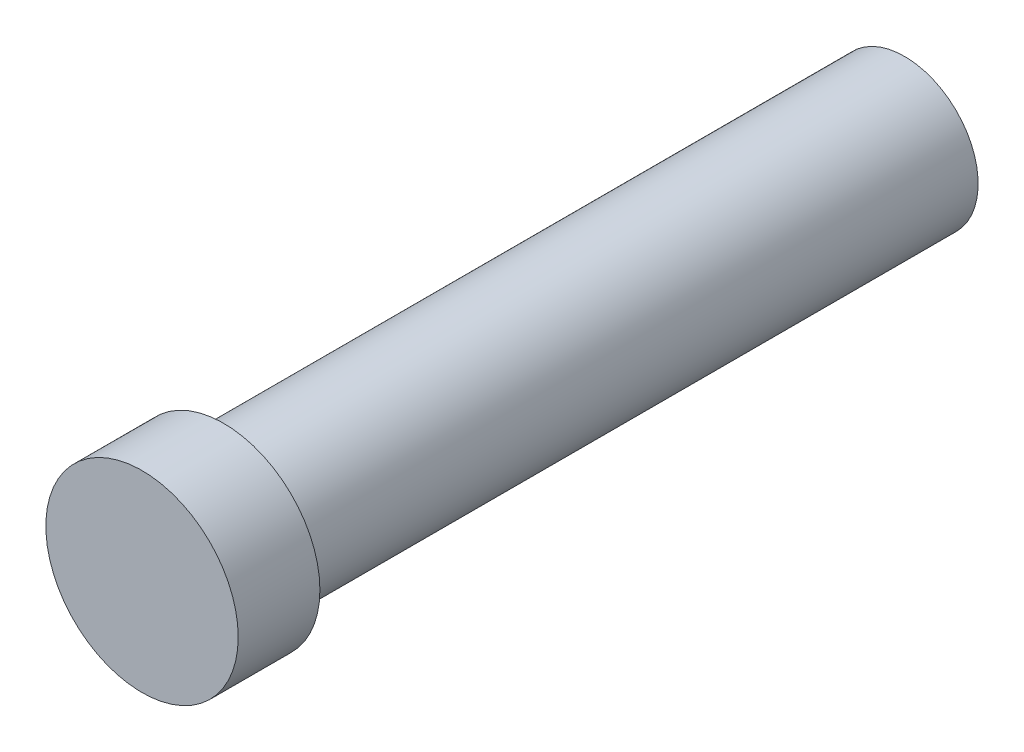
ISO-10303-21;
HEADER;
FILE_DESCRIPTION(('STEP AP214'),'2;1');
FILE_NAME('part.step','',(''),(''),'','','');
FILE_SCHEMA(('AUTOMOTIVE_DESIGN { 1 0 10303 214 1 1 1 1 }'));
ENDSEC;
DATA;
#1=APPLICATION_CONTEXT('core data for automotive mechanical design processes');
#2=APPLICATION_PROTOCOL_DEFINITION('international standard','automotive_design',2000,#1);
#3=PRODUCT_CONTEXT('',#1,'mechanical');
#4=PRODUCT('Part','Part','',(#3));
#5=PRODUCT_RELATED_PRODUCT_CATEGORY('part','',(#4));
#6=PRODUCT_DEFINITION_FORMATION('','',#4);
#7=PRODUCT_DEFINITION_CONTEXT('part definition',#1,'design');
#8=PRODUCT_DEFINITION('design','',#6,#7);
#9=PRODUCT_DEFINITION_SHAPE('','',#8);
#10=(LENGTH_UNIT() NAMED_UNIT(*) SI_UNIT(.MILLI.,.METRE.));
#11=(NAMED_UNIT(*) PLANE_ANGLE_UNIT() SI_UNIT($,.RADIAN.));
#12=(NAMED_UNIT(*) SI_UNIT($,.STERADIAN.) SOLID_ANGLE_UNIT());
#13=UNCERTAINTY_MEASURE_WITH_UNIT(LENGTH_MEASURE(1.E-05),#10,'distance_accuracy_value','');
#14=(GEOMETRIC_REPRESENTATION_CONTEXT(3) GLOBAL_UNCERTAINTY_ASSIGNED_CONTEXT((#13)) GLOBAL_UNIT_ASSIGNED_CONTEXT((#10,
#11,#12)) REPRESENTATION_CONTEXT('',''));
#15=CARTESIAN_POINT('',(0.,0.,0.));
#16=DIRECTION('',(0.,0.,1.));
#17=DIRECTION('',(1.,0.,0.));
#18=AXIS2_PLACEMENT_3D('',#15,#16,#17);
#19=CARTESIAN_POINT('',(0.,0.,14.));
#20=DIRECTION('',(0.,0.,-1.));
#21=DIRECTION('',(-1.,0.,0.));
#22=AXIS2_PLACEMENT_3D('',#19,#20,#21);
#23=CYLINDRICAL_SURFACE('',#22,1.35);
#24=CARTESIAN_POINT('',(0.,0.,0.));
#25=DIRECTION('',(0.,0.,1.));
#26=DIRECTION('',(1.,0.,0.));
#27=AXIS2_PLACEMENT_3D('',#24,#25,#26);
#28=CIRCLE('',#27,1.35);
#29=CARTESIAN_POINT('',(-1.35,0.,0.));
#30=VERTEX_POINT('',#29);
#31=EDGE_CURVE('E50',#30,#30,#28,.T.);
#32=CARTESIAN_POINT('',(0.,0.,12.5));
#33=DIRECTION('',(0.,0.,1.));
#34=DIRECTION('',(1.,0.,0.));
#35=AXIS2_PLACEMENT_3D('',#32,#33,#34);
#36=CIRCLE('',#35,1.35);
#37=CARTESIAN_POINT('',(-1.35,0.,12.5));
#38=VERTEX_POINT('',#37);
#39=EDGE_CURVE('E10',#38,#38,#36,.T.);
#40=CARTESIAN_POINT('',(-1.35,0.,0.));
#41=CARTESIAN_POINT('',(-1.35,0.,0.130208333333332));
#42=CARTESIAN_POINT('',(-1.35,0.,0.260416666666665));
#43=CARTESIAN_POINT('',(-1.35,0.,0.520833333333332));
#44=CARTESIAN_POINT('',(-1.35,0.,0.651041666666666));
#45=CARTESIAN_POINT('',(-1.35,0.,0.911458333333332));
#46=CARTESIAN_POINT('',(-1.35,0.,1.04166666666666));
#47=CARTESIAN_POINT('',(-1.35,0.,1.30208333333333));
#48=CARTESIAN_POINT('',(-1.35,0.,1.43229166666666));
#49=CARTESIAN_POINT('',(-1.35,0.,1.69270833333333));
#50=CARTESIAN_POINT('',(-1.35,0.,1.82291666666666));
#51=CARTESIAN_POINT('',(-1.35,0.,2.08333333333333));
#52=CARTESIAN_POINT('',(-1.35,0.,2.21354166666667));
#53=CARTESIAN_POINT('',(-1.35,0.,2.47395833333333));
#54=CARTESIAN_POINT('',(-1.35,0.,2.60416666666667));
#55=CARTESIAN_POINT('',(-1.35,0.,2.86458333333333));
#56=CARTESIAN_POINT('',(-1.35,0.,2.99479166666666));
#57=CARTESIAN_POINT('',(-1.35,0.,3.25520833333333));
#58=CARTESIAN_POINT('',(-1.35,0.,3.38541666666666));
#59=CARTESIAN_POINT('',(-1.35,0.,3.64583333333333));
#60=CARTESIAN_POINT('',(-1.35,0.,3.77604166666666));
#61=CARTESIAN_POINT('',(-1.35,0.,4.03645833333333));
#62=CARTESIAN_POINT('',(-1.35,0.,4.16666666666667));
#63=CARTESIAN_POINT('',(-1.35,0.,4.42708333333333));
#64=CARTESIAN_POINT('',(-1.35,0.,4.55729166666667));
#65=CARTESIAN_POINT('',(-1.35,0.,4.81770833333333));
#66=CARTESIAN_POINT('',(-1.35,0.,4.94791666666666));
#67=CARTESIAN_POINT('',(-1.35,0.,5.20833333333333));
#68=CARTESIAN_POINT('',(-1.35,0.,5.33854166666667));
#69=CARTESIAN_POINT('',(-1.35,0.,5.59895833333333));
#70=CARTESIAN_POINT('',(-1.35,0.,5.72916666666667));
#71=CARTESIAN_POINT('',(-1.35,0.,5.98958333333333));
#72=CARTESIAN_POINT('',(-1.35,0.,6.11979166666667));
#73=CARTESIAN_POINT('',(-1.35,0.,6.38020833333333));
#74=CARTESIAN_POINT('',(-1.35,0.,6.51041666666666));
#75=CARTESIAN_POINT('',(-1.35,0.,6.77083333333333));
#76=CARTESIAN_POINT('',(-1.35,0.,6.90104166666666));
#77=CARTESIAN_POINT('',(-1.35,0.,7.16145833333333));
#78=CARTESIAN_POINT('',(-1.35,0.,7.29166666666666));
#79=CARTESIAN_POINT('',(-1.35,0.,7.55208333333333));
#80=CARTESIAN_POINT('',(-1.35,0.,7.68229166666666));
#81=CARTESIAN_POINT('',(-1.35,0.,7.94270833333333));
#82=CARTESIAN_POINT('',(-1.35,0.,8.07291666666667));
#83=CARTESIAN_POINT('',(-1.35,0.,8.33333333333333));
#84=CARTESIAN_POINT('',(-1.35,0.,8.46354166666666));
#85=CARTESIAN_POINT('',(-1.35,0.,8.72395833333333));
#86=CARTESIAN_POINT('',(-1.35,0.,8.85416666666666));
#87=CARTESIAN_POINT('',(-1.35,0.,9.11458333333333));
#88=CARTESIAN_POINT('',(-1.35,0.,9.24479166666666));
#89=CARTESIAN_POINT('',(-1.35,0.,9.50520833333333));
#90=CARTESIAN_POINT('',(-1.35,0.,9.63541666666666));
#91=CARTESIAN_POINT('',(-1.35,0.,9.89583333333333));
#92=CARTESIAN_POINT('',(-1.35,0.,10.0260416666667));
#93=CARTESIAN_POINT('',(-1.35,0.,10.2864583333333));
#94=CARTESIAN_POINT('',(-1.35,0.,10.4166666666667));
#95=CARTESIAN_POINT('',(-1.35,0.,10.6770833333333));
#96=CARTESIAN_POINT('',(-1.35,0.,10.8072916666667));
#97=CARTESIAN_POINT('',(-1.35,0.,11.0677083333333));
#98=CARTESIAN_POINT('',(-1.35,0.,11.1979166666667));
#99=CARTESIAN_POINT('',(-1.35,0.,11.4583333333333));
#100=CARTESIAN_POINT('',(-1.35,0.,11.5885416666667));
#101=CARTESIAN_POINT('',(-1.35,0.,11.8489583333333));
#102=CARTESIAN_POINT('',(-1.35,0.,11.9791666666667));
#103=CARTESIAN_POINT('',(-1.35,0.,12.2395833333333));
#104=CARTESIAN_POINT('',(-1.35,0.,12.3697916666667));
#105=CARTESIAN_POINT('',(-1.35,0.,12.5));
#106=B_SPLINE_CURVE_WITH_KNOTS('',3,(#40,#41,#42,#43,#44,#45,#46,#47,#48,#49,#50,#51,#52,#53,
#54,#55,#56,#57,#58,#59,#60,#61,#62,#63,#64,#65,#66,#67,#68,#69,#70,#71,#72,#73,#74,#75,#76,#77,
#78,#79,#80,#81,#82,#83,#84,#85,#86,#87,#88,#89,#90,#91,#92,#93,#94,#95,#96,#97,#98,#99,#100,
#101,#102,#103,#104,#105),.UNSPECIFIED.,.F.,.F.,(4,2,2,2,2,2,2,2,2,2,2,2,2,2,2,2,2,2,2,2,2,2,2,
2,2,2,2,2,2,2,2,2,4),(0.,0.390625,0.781250000000001,1.171875,1.5625,1.953125,2.34375,2.734375,
3.125,3.515625,3.90625,4.296875,4.6875,5.078125,5.46875,5.859375,6.25,6.640625,7.03125,7.421875,
7.8125,8.203125,8.59375,8.984375,9.375,9.765625,10.15625,10.546875,10.9375,11.328125,11.71875,
12.109375,12.5),.UNSPECIFIED.);
#107=EDGE_CURVE('BSEAM43',#30,#38,#106,.T.);
#108=ORIENTED_EDGE('',*,*,#31,.T.);
#109=ORIENTED_EDGE('',*,*,#39,.F.);
#110=ORIENTED_EDGE('',*,*,#107,.T.);
#111=ORIENTED_EDGE('',*,*,#107,.F.);
#112=EDGE_LOOP('',(#108,#110,#109,#111));
#113=FACE_BOUND('',#112,.T.);
#114=ADVANCED_FACE('F43',(#113),#23,.T.);
#115=CARTESIAN_POINT('',(0.,0.,0.));
#116=DIRECTION('',(0.,0.,1.));
#117=DIRECTION('',(1.,0.,0.));
#118=AXIS2_PLACEMENT_3D('',#115,#116,#117);
#119=PLANE('',#118);
#120=ORIENTED_EDGE('',*,*,#31,.F.);
#121=EDGE_LOOP('',(#120));
#122=FACE_BOUND('',#121,.T.);
#123=ADVANCED_FACE('F72',(#122),#119,.F.);
#124=CARTESIAN_POINT('',(0.,0.,12.5));
#125=DIRECTION('',(0.,0.,1.));
#126=DIRECTION('',(1.,0.,0.));
#127=AXIS2_PLACEMENT_3D('',#124,#125,#126);
#128=CYLINDRICAL_SURFACE('',#127,1.76574721168226);
#129=CARTESIAN_POINT('',(0.,0.,12.5));
#130=DIRECTION('',(0.,0.,1.));
#131=DIRECTION('',(1.,0.,0.));
#132=AXIS2_PLACEMENT_3D('',#129,#130,#131);
#133=CIRCLE('',#132,1.76574721168226);
#134=CARTESIAN_POINT('',(1.76574721168226,0.,12.5));
#135=VERTEX_POINT('',#134);
#136=EDGE_CURVE('E55',#135,#135,#133,.T.);
#137=ORIENTED_EDGE('',*,*,#136,.T.);
#138=EDGE_LOOP('',(#137));
#139=FACE_BOUND('',#138,.T.);
#140=CARTESIAN_POINT('',(0.,0.,14.));
#141=DIRECTION('',(0.,0.,1.));
#142=DIRECTION('',(1.,0.,0.));
#143=AXIS2_PLACEMENT_3D('',#140,#141,#142);
#144=CIRCLE('',#143,1.76574721168226);
#145=CARTESIAN_POINT('',(1.76574721168226,0.,14.));
#146=VERTEX_POINT('',#145);
#147=EDGE_CURVE('E60',#146,#146,#144,.T.);
#148=ORIENTED_EDGE('',*,*,#147,.F.);
#149=EDGE_LOOP('',(#148));
#150=FACE_BOUND('',#149,.T.);
#151=ADVANCED_FACE('F69',(#139,#150),#128,.T.);
#152=CARTESIAN_POINT('',(0.,0.,12.5));
#153=DIRECTION('',(0.,0.,1.));
#154=DIRECTION('',(1.,0.,0.));
#155=AXIS2_PLACEMENT_3D('',#152,#153,#154);
#156=PLANE('',#155);
#157=ORIENTED_EDGE('',*,*,#39,.T.);
#158=EDGE_LOOP('',(#157));
#159=FACE_BOUND('',#158,.T.);
#160=ORIENTED_EDGE('',*,*,#136,.F.);
#161=EDGE_LOOP('',(#160));
#162=FACE_BOUND('',#161,.T.);
#163=ADVANCED_FACE('F71',(#159,#162),#156,.F.);
#164=CARTESIAN_POINT('',(0.,0.,14.));
#165=DIRECTION('',(0.,0.,1.));
#166=DIRECTION('',(1.,0.,0.));
#167=AXIS2_PLACEMENT_3D('',#164,#165,#166);
#168=PLANE('',#167);
#169=ORIENTED_EDGE('',*,*,#147,.T.);
#170=EDGE_LOOP('',(#169));
#171=FACE_BOUND('',#170,.T.);
#172=ADVANCED_FACE('F67',(#171),#168,.T.);
#173=CLOSED_SHELL('',(#114,#123,#151,#163,#172));
#174=MANIFOLD_SOLID_BREP('B2',#173);
#175=ADVANCED_BREP_SHAPE_REPRESENTATION('',(#18,#174),#14);
#176=SHAPE_DEFINITION_REPRESENTATION(#9,#175);
ENDSEC;
END-ISO-10303-21;
